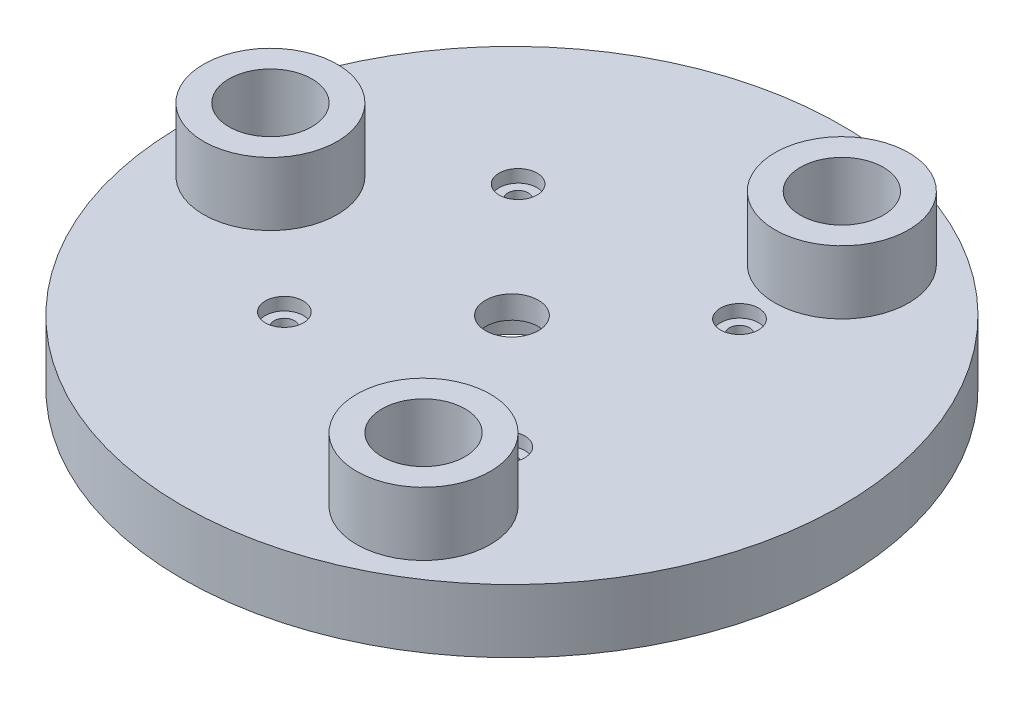
ISO-10303-21;
HEADER;
FILE_DESCRIPTION(('STEP AP214'),'2;1');
FILE_NAME('part.step','',(''),(''),'','','');
FILE_SCHEMA(('AUTOMOTIVE_DESIGN { 1 0 10303 214 1 1 1 1 }'));
ENDSEC;
DATA;
#1=APPLICATION_CONTEXT('core data for automotive mechanical design processes');
#2=APPLICATION_PROTOCOL_DEFINITION('international standard','automotive_design',2000,#1);
#3=PRODUCT_CONTEXT('',#1,'mechanical');
#4=PRODUCT('Part','Part','',(#3));
#5=PRODUCT_RELATED_PRODUCT_CATEGORY('part','',(#4));
#6=PRODUCT_DEFINITION_FORMATION('','',#4);
#7=PRODUCT_DEFINITION_CONTEXT('part definition',#1,'design');
#8=PRODUCT_DEFINITION('design','',#6,#7);
#9=PRODUCT_DEFINITION_SHAPE('','',#8);
#10=(LENGTH_UNIT() NAMED_UNIT(*) SI_UNIT(.MILLI.,.METRE.));
#11=(NAMED_UNIT(*) PLANE_ANGLE_UNIT() SI_UNIT($,.RADIAN.));
#12=(NAMED_UNIT(*) SI_UNIT($,.STERADIAN.) SOLID_ANGLE_UNIT());
#13=UNCERTAINTY_MEASURE_WITH_UNIT(LENGTH_MEASURE(1.E-05),#10,'distance_accuracy_value','');
#14=(GEOMETRIC_REPRESENTATION_CONTEXT(3) GLOBAL_UNCERTAINTY_ASSIGNED_CONTEXT((#13)) GLOBAL_UNIT_ASSIGNED_CONTEXT((#10,
#11,#12)) REPRESENTATION_CONTEXT('',''));
#15=CARTESIAN_POINT('',(0.,0.,0.));
#16=DIRECTION('',(0.,0.,1.));
#17=DIRECTION('',(1.,0.,0.));
#18=AXIS2_PLACEMENT_3D('',#15,#16,#17);
#19=CARTESIAN_POINT('',(-9.22076389517279,0.,8.73312734302385));
#20=DIRECTION('',(0.,1.,0.));
#21=DIRECTION('',(0.,0.,1.));
#22=AXIS2_PLACEMENT_3D('',#19,#20,#21);
#23=CYLINDRICAL_SURFACE('',#22,0.800000000000784);
#24=CARTESIAN_POINT('',(-9.22076389517279,0.,8.73312734302385));
#25=DIRECTION('',(0.,1.,0.));
#26=DIRECTION('',(0.,0.,1.));
#27=AXIS2_PLACEMENT_3D('',#24,#25,#26);
#28=CIRCLE('',#27,0.800000000000784);
#29=CARTESIAN_POINT('',(-9.22076389517279,0.,9.53312734302463));
#30=VERTEX_POINT('',#29);
#31=EDGE_CURVE('E61',#30,#30,#28,.T.);
#32=ORIENTED_EDGE('',*,*,#31,.F.);
#33=EDGE_LOOP('',(#32));
#34=FACE_BOUND('',#33,.T.);
#35=CARTESIAN_POINT('',(-9.22076389517279,4.,8.73312734302385));
#36=DIRECTION('',(0.,1.,0.));
#37=DIRECTION('',(0.,0.,1.));
#38=AXIS2_PLACEMENT_3D('',#35,#36,#37);
#39=CIRCLE('',#38,0.800000000000784);
#40=CARTESIAN_POINT('',(-9.22076389517279,4.,9.53312734302463));
#41=VERTEX_POINT('',#40);
#42=EDGE_CURVE('E35',#41,#41,#39,.F.);
#43=ORIENTED_EDGE('',*,*,#42,.F.);
#44=EDGE_LOOP('',(#43));
#45=FACE_BOUND('',#44,.T.);
#46=ADVANCED_FACE('F31',(#34,#45),#23,.F.);
#47=CARTESIAN_POINT('',(8.73312734302434,0.,9.22076389517291));
#48=DIRECTION('',(0.,1.,0.));
#49=DIRECTION('',(0.,0.,1.));
#50=AXIS2_PLACEMENT_3D('',#47,#48,#49);
#51=CYLINDRICAL_SURFACE('',#50,0.800000000000784);
#52=CARTESIAN_POINT('',(8.73312734302434,0.,9.22076389517291));
#53=DIRECTION('',(0.,1.,0.));
#54=DIRECTION('',(0.,0.,1.));
#55=AXIS2_PLACEMENT_3D('',#52,#53,#54);
#56=CIRCLE('',#55,0.800000000000784);
#57=CARTESIAN_POINT('',(8.73312734302434,0.,10.0207638951737));
#58=VERTEX_POINT('',#57);
#59=EDGE_CURVE('E94',#58,#58,#56,.T.);
#60=ORIENTED_EDGE('',*,*,#59,.F.);
#61=EDGE_LOOP('',(#60));
#62=FACE_BOUND('',#61,.T.);
#63=CARTESIAN_POINT('',(8.73312734302434,4.,9.22076389517291));
#64=DIRECTION('',(0.,1.,0.));
#65=DIRECTION('',(0.,0.,1.));
#66=AXIS2_PLACEMENT_3D('',#63,#64,#65);
#67=CIRCLE('',#66,0.800000000000784);
#68=CARTESIAN_POINT('',(8.73312734302434,4.,10.0207638951737));
#69=VERTEX_POINT('',#68);
#70=EDGE_CURVE('E67',#69,#69,#67,.F.);
#71=ORIENTED_EDGE('',*,*,#70,.F.);
#72=EDGE_LOOP('',(#71));
#73=FACE_BOUND('',#72,.T.);
#74=ADVANCED_FACE('F158',(#62,#73),#51,.F.);
#75=CARTESIAN_POINT('',(9.2207638951734,0.,-8.73312734302422));
#76=DIRECTION('',(0.,1.,0.));
#77=DIRECTION('',(0.,0.,1.));
#78=AXIS2_PLACEMENT_3D('',#75,#76,#77);
#79=CYLINDRICAL_SURFACE('',#78,0.800000000000784);
#80=CARTESIAN_POINT('',(9.2207638951734,0.,-8.73312734302422));
#81=DIRECTION('',(0.,1.,0.));
#82=DIRECTION('',(0.,0.,1.));
#83=AXIS2_PLACEMENT_3D('',#80,#81,#82);
#84=CIRCLE('',#83,0.800000000000784);
#85=CARTESIAN_POINT('',(9.2207638951734,0.,-7.93312734302344));
#86=VERTEX_POINT('',#85);
#87=EDGE_CURVE('E97',#86,#86,#84,.T.);
#88=ORIENTED_EDGE('',*,*,#87,.F.);
#89=EDGE_LOOP('',(#88));
#90=FACE_BOUND('',#89,.T.);
#91=CARTESIAN_POINT('',(9.2207638951734,4.,-8.73312734302422));
#92=DIRECTION('',(0.,1.,0.));
#93=DIRECTION('',(0.,0.,1.));
#94=AXIS2_PLACEMENT_3D('',#91,#92,#93);
#95=CIRCLE('',#94,0.800000000000784);
#96=CARTESIAN_POINT('',(9.2207638951734,4.,-7.93312734302344));
#97=VERTEX_POINT('',#96);
#98=EDGE_CURVE('E63',#97,#97,#95,.F.);
#99=ORIENTED_EDGE('',*,*,#98,.F.);
#100=EDGE_LOOP('',(#99));
#101=FACE_BOUND('',#100,.T.);
#102=ADVANCED_FACE('F164',(#90,#101),#79,.F.);
#103=CARTESIAN_POINT('',(-8.73312734302373,0.,-9.22076389517329));
#104=DIRECTION('',(0.,1.,0.));
#105=DIRECTION('',(0.,0.,1.));
#106=AXIS2_PLACEMENT_3D('',#103,#104,#105);
#107=CYLINDRICAL_SURFACE('',#106,0.800000000000784);
#108=CARTESIAN_POINT('',(-8.73312734302373,0.,-9.22076389517329));
#109=DIRECTION('',(0.,1.,0.));
#110=DIRECTION('',(0.,0.,1.));
#111=AXIS2_PLACEMENT_3D('',#108,#109,#110);
#112=CIRCLE('',#111,0.800000000000784);
#113=CARTESIAN_POINT('',(-8.73312734302373,0.,-8.4207638951725));
#114=VERTEX_POINT('',#113);
#115=EDGE_CURVE('E100',#114,#114,#112,.T.);
#116=ORIENTED_EDGE('',*,*,#115,.F.);
#117=EDGE_LOOP('',(#116));
#118=FACE_BOUND('',#117,.T.);
#119=CARTESIAN_POINT('',(-8.73312734302373,4.,-9.22076389517329));
#120=DIRECTION('',(0.,1.,0.));
#121=DIRECTION('',(0.,0.,1.));
#122=AXIS2_PLACEMENT_3D('',#119,#120,#121);
#123=CIRCLE('',#122,0.800000000000784);
#124=CARTESIAN_POINT('',(-8.73312734302373,4.,-8.4207638951725));
#125=VERTEX_POINT('',#124);
#126=EDGE_CURVE('E58',#125,#125,#123,.F.);
#127=ORIENTED_EDGE('',*,*,#126,.F.);
#128=EDGE_LOOP('',(#127));
#129=FACE_BOUND('',#128,.T.);
#130=ADVANCED_FACE('F175',(#118,#129),#107,.F.);
#131=CARTESIAN_POINT('',(0.,10.,2.99231768478796E-13));
#132=DIRECTION('',(0.,-1.,0.));
#133=DIRECTION('',(0.,0.,-1.));
#134=AXIS2_PLACEMENT_3D('',#131,#132,#133);
#135=CYLINDRICAL_SURFACE('',#134,2.08564814814815);
#136=CARTESIAN_POINT('',(0.,5.,2.99231768478796E-13));
#137=DIRECTION('',(0.,1.,0.));
#138=DIRECTION('',(0.,0.,1.));
#139=AXIS2_PLACEMENT_3D('',#136,#137,#138);
#140=CIRCLE('',#139,2.08564814814815);
#141=CARTESIAN_POINT('',(0.,5.,2.08564814814845));
#142=VERTEX_POINT('',#141);
#143=EDGE_CURVE('E48',#142,#142,#140,.T.);
#144=ORIENTED_EDGE('',*,*,#143,.T.);
#145=EDGE_LOOP('',(#144));
#146=FACE_BOUND('',#145,.T.);
#147=CARTESIAN_POINT('',(0.,3.2,2.99231768478796E-13));
#148=DIRECTION('',(0.,-1.,0.));
#149=DIRECTION('',(0.,0.,-1.));
#150=AXIS2_PLACEMENT_3D('',#147,#148,#149);
#151=CIRCLE('',#150,2.08564814814815);
#152=CARTESIAN_POINT('',(0.,3.2,-2.08564814814785));
#153=VERTEX_POINT('',#152);
#154=EDGE_CURVE('E53',#153,#153,#151,.T.);
#155=ORIENTED_EDGE('',*,*,#154,.T.);
#156=EDGE_LOOP('',(#155));
#157=FACE_BOUND('',#156,.T.);
#158=ADVANCED_FACE('F179',(#146,#157),#135,.F.);
#159=CARTESIAN_POINT('',(0.,10.,2.99231768478796E-13));
#160=DIRECTION('',(0.,1.,0.));
#161=DIRECTION('',(0.,0.,1.));
#162=AXIS2_PLACEMENT_3D('',#159,#160,#161);
#163=PLANE('',#162);
#164=CARTESIAN_POINT('',(9.52625000000018,10.,-16.4999490056029));
#165=DIRECTION('',(0.,-1.,0.));
#166=DIRECTION('',(0.,0.,-1.));
#167=AXIS2_PLACEMENT_3D('',#164,#165,#166);
#168=CIRCLE('',#167,3.27499999999973);
#169=CARTESIAN_POINT('',(9.52625000000018,10.,-19.7749490056027));
#170=VERTEX_POINT('',#169);
#171=EDGE_CURVE('E44',#170,#170,#168,.T.);
#172=ORIENTED_EDGE('',*,*,#171,.T.);
#173=EDGE_LOOP('',(#172));
#174=FACE_BOUND('',#173,.T.);
#175=CARTESIAN_POINT('',(9.52625000000018,10.,-16.4999490056029));
#176=DIRECTION('',(0.,1.,0.));
#177=DIRECTION('',(0.,0.,1.));
#178=AXIS2_PLACEMENT_3D('',#175,#176,#177);
#179=CIRCLE('',#178,5.27499999999971);
#180=CARTESIAN_POINT('',(9.52625000000018,10.,-11.2249490056032));
#181=VERTEX_POINT('',#180);
#182=EDGE_CURVE('E117',#181,#181,#179,.T.);
#183=ORIENTED_EDGE('',*,*,#182,.T.);
#184=EDGE_LOOP('',(#183));
#185=FACE_BOUND('',#184,.T.);
#186=ADVANCED_FACE('F153',(#174,#185),#163,.T.);
#187=CARTESIAN_POINT('',(9.52625000000018,2.5,-16.4999490056029));
#188=DIRECTION('',(0.,1.,0.));
#189=DIRECTION('',(0.,0.,1.));
#190=AXIS2_PLACEMENT_3D('',#187,#188,#189);
#191=CYLINDRICAL_SURFACE('',#190,3.27499999999973);
#192=CARTESIAN_POINT('',(9.52625000000018,2.5,-16.4999490056029));
#193=DIRECTION('',(0.,-1.,0.));
#194=DIRECTION('',(0.,0.,-1.));
#195=AXIS2_PLACEMENT_3D('',#192,#193,#194);
#196=CIRCLE('',#195,3.27499999999973);
#197=CARTESIAN_POINT('',(9.52625000000018,2.5,-19.7749490056027));
#198=VERTEX_POINT('',#197);
#199=EDGE_CURVE('E39',#198,#198,#196,.T.);
#200=ORIENTED_EDGE('',*,*,#199,.T.);
#201=EDGE_LOOP('',(#200));
#202=FACE_BOUND('',#201,.T.);
#203=ORIENTED_EDGE('',*,*,#171,.F.);
#204=EDGE_LOOP('',(#203));
#205=FACE_BOUND('',#204,.T.);
#206=ADVANCED_FACE('F229',(#202,#205),#191,.F.);
#207=CARTESIAN_POINT('',(9.52625000000018,2.5,-16.4999490056029));
#208=DIRECTION('',(0.,-1.,0.));
#209=DIRECTION('',(0.,0.,-1.));
#210=AXIS2_PLACEMENT_3D('',#207,#208,#209);
#211=PLANE('',#210);
#212=ORIENTED_EDGE('',*,*,#199,.F.);
#213=EDGE_LOOP('',(#212));
#214=FACE_BOUND('',#213,.T.);
#215=ADVANCED_FACE('F207',(#214),#211,.F.);
#216=CARTESIAN_POINT('',(0.,5.,3.04877650902924E-13));
#217=DIRECTION('',(0.,1.,0.));
#218=DIRECTION('',(0.,0.,1.));
#219=AXIS2_PLACEMENT_3D('',#216,#217,#218);
#220=PLANE('',#219);
#221=CARTESIAN_POINT('',(-9.22076389517278,5.,8.73312734302375));
#222=DIRECTION('',(0.,1.,0.));
#223=DIRECTION('',(0.,0.,1.));
#224=AXIS2_PLACEMENT_3D('',#221,#222,#223);
#225=CIRCLE('',#224,1.500000048);
#226=CARTESIAN_POINT('',(-9.22076389517278,5.,10.2331273910237));
#227=VERTEX_POINT('',#226);
#228=EDGE_CURVE('E83',#227,#227,#225,.T.);
#229=ORIENTED_EDGE('',*,*,#228,.F.);
#230=EDGE_LOOP('',(#229));
#231=FACE_BOUND('',#230,.T.);
#232=CARTESIAN_POINT('',(8.73312734302425,5.,9.22076389517279));
#233=DIRECTION('',(0.,1.,0.));
#234=DIRECTION('',(0.,0.,1.));
#235=AXIS2_PLACEMENT_3D('',#232,#233,#234);
#236=CIRCLE('',#235,1.500000048);
#237=CARTESIAN_POINT('',(8.73312734302425,5.,10.7207639431728));
#238=VERTEX_POINT('',#237);
#239=EDGE_CURVE('E76',#238,#238,#236,.T.);
#240=ORIENTED_EDGE('',*,*,#239,.F.);
#241=EDGE_LOOP('',(#240));
#242=FACE_BOUND('',#241,.T.);
#243=CARTESIAN_POINT('',(9.2207638951733,5.,-8.73312734302424));
#244=DIRECTION('',(0.,1.,0.));
#245=DIRECTION('',(0.,0.,1.));
#246=AXIS2_PLACEMENT_3D('',#243,#244,#245);
#247=CIRCLE('',#246,1.500000048);
#248=CARTESIAN_POINT('',(9.2207638951733,5.,-7.23312729502424));
#249=VERTEX_POINT('',#248);
#250=EDGE_CURVE('E69',#249,#249,#247,.T.);
#251=ORIENTED_EDGE('',*,*,#250,.F.);
#252=EDGE_LOOP('',(#251));
#253=FACE_BOUND('',#252,.T.);
#254=CARTESIAN_POINT('',(-8.73312734302373,5.,-9.22076389517329));
#255=DIRECTION('',(0.,1.,0.));
#256=DIRECTION('',(0.,0.,1.));
#257=AXIS2_PLACEMENT_3D('',#254,#255,#256);
#258=CIRCLE('',#257,1.500000048);
#259=CARTESIAN_POINT('',(-8.73312734302373,5.,-7.72076384717329));
#260=VERTEX_POINT('',#259);
#261=EDGE_CURVE('E65',#260,#260,#258,.T.);
#262=ORIENTED_EDGE('',*,*,#261,.F.);
#263=EDGE_LOOP('',(#262));
#264=FACE_BOUND('',#263,.T.);
#265=ORIENTED_EDGE('',*,*,#143,.F.);
#266=EDGE_LOOP('',(#265));
#267=FACE_BOUND('',#266,.T.);
#268=CARTESIAN_POINT('',(-19.0524999999996,5.,0.));
#269=DIRECTION('',(0.,1.,0.));
#270=DIRECTION('',(0.,0.,1.));
#271=AXIS2_PLACEMENT_3D('',#268,#269,#270);
#272=CIRCLE('',#271,5.27499999999964);
#273=CARTESIAN_POINT('',(-19.0524999999996,5.,5.2749999999997));
#274=VERTEX_POINT('',#273);
#275=EDGE_CURVE('E108',#274,#274,#272,.T.);
#276=ORIENTED_EDGE('',*,*,#275,.F.);
#277=EDGE_LOOP('',(#276));
#278=FACE_BOUND('',#277,.T.);
#279=CARTESIAN_POINT('',(9.52625000000006,5.,16.4999490056029));
#280=DIRECTION('',(0.,1.,0.));
#281=DIRECTION('',(0.,0.,1.));
#282=AXIS2_PLACEMENT_3D('',#279,#280,#281);
#283=CIRCLE('',#282,5.275);
#284=CARTESIAN_POINT('',(9.52625000000006,5.,21.7749490056029));
#285=VERTEX_POINT('',#284);
#286=EDGE_CURVE('E114',#285,#285,#283,.T.);
#287=ORIENTED_EDGE('',*,*,#286,.F.);
#288=EDGE_LOOP('',(#287));
#289=FACE_BOUND('',#288,.T.);
#290=CARTESIAN_POINT('',(9.52625000000018,5.,-16.4999490056029));
#291=DIRECTION('',(0.,1.,0.));
#292=DIRECTION('',(0.,0.,1.));
#293=AXIS2_PLACEMENT_3D('',#290,#291,#292);
#294=CIRCLE('',#293,5.27499999999971);
#295=CARTESIAN_POINT('',(9.52625000000018,5.,-11.2249490056032));
#296=VERTEX_POINT('',#295);
#297=EDGE_CURVE('E120',#296,#296,#294,.T.);
#298=ORIENTED_EDGE('',*,*,#297,.F.);
#299=EDGE_LOOP('',(#298));
#300=FACE_BOUND('',#299,.T.);
#301=CARTESIAN_POINT('',(0.,5.,3.04877650902924E-13));
#302=DIRECTION('',(0.,1.,0.));
#303=DIRECTION('',(0.,0.,1.));
#304=AXIS2_PLACEMENT_3D('',#301,#302,#303);
#305=CIRCLE('',#304,26.);
#306=CARTESIAN_POINT('',(0.,5.,26.0000000000003));
#307=VERTEX_POINT('',#306);
#308=EDGE_CURVE('E52',#307,#307,#305,.T.);
#309=ORIENTED_EDGE('',*,*,#308,.T.);
#310=EDGE_LOOP('',(#309));
#311=FACE_BOUND('',#310,.T.);
#312=ADVANCED_FACE('F203',(#231,#242,#253,#264,#267,#278,#289,#300,#311),#220,.T.);
#313=CARTESIAN_POINT('',(9.52625000000018,5.,-16.4999490056029));
#314=DIRECTION('',(0.,1.,0.));
#315=DIRECTION('',(0.,0.,1.));
#316=AXIS2_PLACEMENT_3D('',#313,#314,#315);
#317=CYLINDRICAL_SURFACE('',#316,5.27499999999971);
#318=ORIENTED_EDGE('',*,*,#297,.T.);
#319=EDGE_LOOP('',(#318));
#320=FACE_BOUND('',#319,.T.);
#321=ORIENTED_EDGE('',*,*,#182,.F.);
#322=EDGE_LOOP('',(#321));
#323=FACE_BOUND('',#322,.T.);
#324=ADVANCED_FACE('F199',(#320,#323),#317,.T.);
#325=CARTESIAN_POINT('',(9.52625000000006,5.,16.4999490056029));
#326=DIRECTION('',(0.,1.,0.));
#327=DIRECTION('',(0.,0.,1.));
#328=AXIS2_PLACEMENT_3D('',#325,#326,#327);
#329=CYLINDRICAL_SURFACE('',#328,5.275);
#330=ORIENTED_EDGE('',*,*,#286,.T.);
#331=EDGE_LOOP('',(#330));
#332=FACE_BOUND('',#331,.T.);
#333=CARTESIAN_POINT('',(9.52625000000006,10.,16.4999490056029));
#334=DIRECTION('',(0.,1.,0.));
#335=DIRECTION('',(0.,0.,1.));
#336=AXIS2_PLACEMENT_3D('',#333,#334,#335);
#337=CIRCLE('',#336,5.275);
#338=CARTESIAN_POINT('',(9.52625000000006,10.,21.7749490056029));
#339=VERTEX_POINT('',#338);
#340=EDGE_CURVE('E111',#339,#339,#337,.T.);
#341=ORIENTED_EDGE('',*,*,#340,.F.);
#342=EDGE_LOOP('',(#341));
#343=FACE_BOUND('',#342,.T.);
#344=ADVANCED_FACE('F195',(#332,#343),#329,.T.);
#345=CARTESIAN_POINT('',(-19.0524999999996,5.,0.));
#346=DIRECTION('',(0.,1.,0.));
#347=DIRECTION('',(0.,0.,1.));
#348=AXIS2_PLACEMENT_3D('',#345,#346,#347);
#349=CYLINDRICAL_SURFACE('',#348,5.27499999999964);
#350=ORIENTED_EDGE('',*,*,#275,.T.);
#351=EDGE_LOOP('',(#350));
#352=FACE_BOUND('',#351,.T.);
#353=CARTESIAN_POINT('',(-19.0524999999996,10.,0.));
#354=DIRECTION('',(0.,1.,0.));
#355=DIRECTION('',(0.,0.,1.));
#356=AXIS2_PLACEMENT_3D('',#353,#354,#355);
#357=CIRCLE('',#356,5.27499999999964);
#358=CARTESIAN_POINT('',(-19.0524999999996,10.,5.2749999999997));
#359=VERTEX_POINT('',#358);
#360=EDGE_CURVE('E56',#359,#359,#357,.T.);
#361=ORIENTED_EDGE('',*,*,#360,.F.);
#362=EDGE_LOOP('',(#361));
#363=FACE_BOUND('',#362,.T.);
#364=ADVANCED_FACE('F191',(#352,#363),#349,.T.);
#365=CARTESIAN_POINT('',(-19.0524999999996,2.5,0.));
#366=DIRECTION('',(0.,-1.,0.));
#367=DIRECTION('',(0.,0.,-1.));
#368=AXIS2_PLACEMENT_3D('',#365,#366,#367);
#369=PLANE('',#368);
#370=CARTESIAN_POINT('',(-19.0524999999996,2.5,0.));
#371=DIRECTION('',(0.,-1.,0.));
#372=DIRECTION('',(0.,0.,-1.));
#373=AXIS2_PLACEMENT_3D('',#370,#371,#372);
#374=CIRCLE('',#373,3.27499999999954);
#375=CARTESIAN_POINT('',(-19.0524999999996,2.5,-3.27499999999948));
#376=VERTEX_POINT('',#375);
#377=EDGE_CURVE('E127',#376,#376,#374,.T.);
#378=ORIENTED_EDGE('',*,*,#377,.F.);
#379=EDGE_LOOP('',(#378));
#380=FACE_BOUND('',#379,.T.);
#381=ADVANCED_FACE('F194',(#380),#369,.F.);
#382=CARTESIAN_POINT('',(-19.0524999999996,2.5,0.));
#383=DIRECTION('',(0.,1.,0.));
#384=DIRECTION('',(0.,0.,1.));
#385=AXIS2_PLACEMENT_3D('',#382,#383,#384);
#386=CYLINDRICAL_SURFACE('',#385,3.27499999999954);
#387=ORIENTED_EDGE('',*,*,#377,.T.);
#388=EDGE_LOOP('',(#387));
#389=FACE_BOUND('',#388,.T.);
#390=CARTESIAN_POINT('',(-19.0524999999996,10.,0.));
#391=DIRECTION('',(0.,-1.,0.));
#392=DIRECTION('',(0.,0.,-1.));
#393=AXIS2_PLACEMENT_3D('',#390,#391,#392);
#394=CIRCLE('',#393,3.27499999999954);
#395=CARTESIAN_POINT('',(-19.0524999999996,10.,-3.27499999999948));
#396=VERTEX_POINT('',#395);
#397=EDGE_CURVE('E51',#396,#396,#394,.T.);
#398=ORIENTED_EDGE('',*,*,#397,.F.);
#399=EDGE_LOOP('',(#398));
#400=FACE_BOUND('',#399,.T.);
#401=ADVANCED_FACE('F211',(#389,#400),#386,.F.);
#402=ORIENTED_EDGE('',*,*,#397,.T.);
#403=EDGE_LOOP('',(#402));
#404=FACE_BOUND('',#403,.T.);
#405=ORIENTED_EDGE('',*,*,#360,.T.);
#406=EDGE_LOOP('',(#405));
#407=FACE_BOUND('',#406,.T.);
#408=ADVANCED_FACE('F152',(#404,#407),#163,.T.);
#409=CARTESIAN_POINT('',(9.52625000000006,2.5,16.4999490056029));
#410=DIRECTION('',(0.,-1.,0.));
#411=DIRECTION('',(0.,0.,-1.));
#412=AXIS2_PLACEMENT_3D('',#409,#410,#411);
#413=PLANE('',#412);
#414=CARTESIAN_POINT('',(9.52625000000006,2.5,16.4999490056029));
#415=DIRECTION('',(0.,-1.,0.));
#416=DIRECTION('',(0.,0.,-1.));
#417=AXIS2_PLACEMENT_3D('',#414,#415,#416);
#418=CIRCLE('',#417,3.275);
#419=CARTESIAN_POINT('',(9.52625000000006,2.5,13.2249490056029));
#420=VERTEX_POINT('',#419);
#421=EDGE_CURVE('E133',#420,#420,#418,.T.);
#422=ORIENTED_EDGE('',*,*,#421,.F.);
#423=EDGE_LOOP('',(#422));
#424=FACE_BOUND('',#423,.T.);
#425=ADVANCED_FACE('F144',(#424),#413,.F.);
#426=CARTESIAN_POINT('',(9.52625000000006,2.5,16.4999490056029));
#427=DIRECTION('',(0.,1.,0.));
#428=DIRECTION('',(0.,0.,1.));
#429=AXIS2_PLACEMENT_3D('',#426,#427,#428);
#430=CYLINDRICAL_SURFACE('',#429,3.275);
#431=ORIENTED_EDGE('',*,*,#421,.T.);
#432=EDGE_LOOP('',(#431));
#433=FACE_BOUND('',#432,.T.);
#434=CARTESIAN_POINT('',(9.52625000000006,10.,16.4999490056029));
#435=DIRECTION('',(0.,-1.,0.));
#436=DIRECTION('',(0.,0.,-1.));
#437=AXIS2_PLACEMENT_3D('',#434,#435,#436);
#438=CIRCLE('',#437,3.275);
#439=CARTESIAN_POINT('',(9.52625000000006,10.,13.2249490056029));
#440=VERTEX_POINT('',#439);
#441=EDGE_CURVE('E130',#440,#440,#438,.T.);
#442=ORIENTED_EDGE('',*,*,#441,.F.);
#443=EDGE_LOOP('',(#442));
#444=FACE_BOUND('',#443,.T.);
#445=ADVANCED_FACE('F142',(#433,#444),#430,.F.);
#446=ORIENTED_EDGE('',*,*,#441,.T.);
#447=EDGE_LOOP('',(#446));
#448=FACE_BOUND('',#447,.T.);
#449=ORIENTED_EDGE('',*,*,#340,.T.);
#450=EDGE_LOOP('',(#449));
#451=FACE_BOUND('',#450,.T.);
#452=ADVANCED_FACE('F139',(#448,#451),#163,.T.);
#453=CARTESIAN_POINT('',(0.,10.,2.99231768478796E-13));
#454=DIRECTION('',(0.,-1.,0.));
#455=DIRECTION('',(0.,0.,-1.));
#456=AXIS2_PLACEMENT_3D('',#453,#454,#455);
#457=CYLINDRICAL_SURFACE('',#456,26.);
#458=CARTESIAN_POINT('',(0.,0.,2.99231768478796E-13));
#459=DIRECTION('',(0.,1.,0.));
#460=DIRECTION('',(0.,0.,1.));
#461=AXIS2_PLACEMENT_3D('',#458,#459,#460);
#462=CIRCLE('',#461,26.);
#463=CARTESIAN_POINT('',(0.,0.,26.0000000000003));
#464=VERTEX_POINT('',#463);
#465=EDGE_CURVE('E10',#464,#464,#462,.T.);
#466=ORIENTED_EDGE('',*,*,#465,.T.);
#467=EDGE_LOOP('',(#466));
#468=FACE_BOUND('',#467,.T.);
#469=ORIENTED_EDGE('',*,*,#308,.F.);
#470=EDGE_LOOP('',(#469));
#471=FACE_BOUND('',#470,.T.);
#472=ADVANCED_FACE('F33',(#468,#471),#457,.T.);
#473=CARTESIAN_POINT('',(0.,0.,2.99231768478796E-13));
#474=DIRECTION('',(0.,1.,0.));
#475=DIRECTION('',(0.,0.,1.));
#476=AXIS2_PLACEMENT_3D('',#473,#474,#475);
#477=PLANE('',#476);
#478=ORIENTED_EDGE('',*,*,#31,.T.);
#479=EDGE_LOOP('',(#478));
#480=FACE_BOUND('',#479,.T.);
#481=ORIENTED_EDGE('',*,*,#59,.T.);
#482=EDGE_LOOP('',(#481));
#483=FACE_BOUND('',#482,.T.);
#484=ORIENTED_EDGE('',*,*,#87,.T.);
#485=EDGE_LOOP('',(#484));
#486=FACE_BOUND('',#485,.T.);
#487=ORIENTED_EDGE('',*,*,#115,.T.);
#488=EDGE_LOOP('',(#487));
#489=FACE_BOUND('',#488,.T.);
#490=CARTESIAN_POINT('',(0.,0.,3.04877650902924E-13));
#491=DIRECTION('',(0.,-1.,0.));
#492=DIRECTION('',(0.,0.,-1.));
#493=AXIS2_PLACEMENT_3D('',#490,#491,#492);
#494=CIRCLE('',#493,5.25);
#495=CARTESIAN_POINT('',(0.,0.,-5.2499999999997));
#496=VERTEX_POINT('',#495);
#497=EDGE_CURVE('E103',#496,#496,#494,.T.);
#498=ORIENTED_EDGE('',*,*,#497,.F.);
#499=EDGE_LOOP('',(#498));
#500=FACE_BOUND('',#499,.T.);
#501=ORIENTED_EDGE('',*,*,#465,.F.);
#502=EDGE_LOOP('',(#501));
#503=FACE_BOUND('',#502,.T.);
#504=ADVANCED_FACE('F189',(#480,#483,#486,#489,#500,#503),#477,.F.);
#505=CARTESIAN_POINT('',(0.,3.2,3.04877650902924E-13));
#506=DIRECTION('',(0.,-1.,0.));
#507=DIRECTION('',(0.,0.,-1.));
#508=AXIS2_PLACEMENT_3D('',#505,#506,#507);
#509=CYLINDRICAL_SURFACE('',#508,5.25);
#510=CARTESIAN_POINT('',(0.,3.2,3.04877650902924E-13));
#511=DIRECTION('',(0.,-1.,0.));
#512=DIRECTION('',(0.,0.,-1.));
#513=AXIS2_PLACEMENT_3D('',#510,#511,#512);
#514=CIRCLE('',#513,5.25);
#515=CARTESIAN_POINT('',(0.,3.2,-5.2499999999997));
#516=VERTEX_POINT('',#515);
#517=EDGE_CURVE('E57',#516,#516,#514,.T.);
#518=ORIENTED_EDGE('',*,*,#517,.F.);
#519=EDGE_LOOP('',(#518));
#520=FACE_BOUND('',#519,.T.);
#521=ORIENTED_EDGE('',*,*,#497,.T.);
#522=EDGE_LOOP('',(#521));
#523=FACE_BOUND('',#522,.T.);
#524=ADVANCED_FACE('F185',(#520,#523),#509,.F.);
#525=CARTESIAN_POINT('',(0.,3.2,3.04877650902924E-13));
#526=DIRECTION('',(0.,-1.,0.));
#527=DIRECTION('',(0.,0.,-1.));
#528=AXIS2_PLACEMENT_3D('',#525,#526,#527);
#529=PLANE('',#528);
#530=ORIENTED_EDGE('',*,*,#154,.F.);
#531=EDGE_LOOP('',(#530));
#532=FACE_BOUND('',#531,.T.);
#533=ORIENTED_EDGE('',*,*,#517,.T.);
#534=EDGE_LOOP('',(#533));
#535=FACE_BOUND('',#534,.T.);
#536=ADVANCED_FACE('F181',(#532,#535),#529,.T.);
#537=CARTESIAN_POINT('',(-8.73312734302373,4.,-9.22076389517329));
#538=DIRECTION('',(0.,1.,0.));
#539=DIRECTION('',(0.,0.,1.));
#540=AXIS2_PLACEMENT_3D('',#537,#538,#539);
#541=PLANE('',#540);
#542=CARTESIAN_POINT('',(-8.73312734302373,4.,-9.22076389517329));
#543=DIRECTION('',(0.,1.,0.));
#544=DIRECTION('',(0.,0.,1.));
#545=AXIS2_PLACEMENT_3D('',#542,#543,#544);
#546=CIRCLE('',#545,1.500000048);
#547=CARTESIAN_POINT('',(-8.73312734302373,4.,-7.72076384717329));
#548=VERTEX_POINT('',#547);
#549=EDGE_CURVE('E62',#548,#548,#546,.T.);
#550=ORIENTED_EDGE('',*,*,#549,.T.);
#551=EDGE_LOOP('',(#550));
#552=FACE_BOUND('',#551,.T.);
#553=ORIENTED_EDGE('',*,*,#126,.T.);
#554=EDGE_LOOP('',(#553));
#555=FACE_BOUND('',#554,.T.);
#556=ADVANCED_FACE('F184',(#552,#555),#541,.T.);
#557=CARTESIAN_POINT('',(-8.73312734302373,4.,-9.22076389517329));
#558=DIRECTION('',(0.,1.,0.));
#559=DIRECTION('',(0.,0.,1.));
#560=AXIS2_PLACEMENT_3D('',#557,#558,#559);
#561=CYLINDRICAL_SURFACE('',#560,1.500000048);
#562=ORIENTED_EDGE('',*,*,#549,.F.);
#563=EDGE_LOOP('',(#562));
#564=FACE_BOUND('',#563,.T.);
#565=ORIENTED_EDGE('',*,*,#261,.T.);
#566=EDGE_LOOP('',(#565));
#567=FACE_BOUND('',#566,.T.);
#568=ADVANCED_FACE('F170',(#564,#567),#561,.F.);
#569=CARTESIAN_POINT('',(9.2207638951733,4.,-8.73312734302424));
#570=DIRECTION('',(0.,1.,0.));
#571=DIRECTION('',(0.,0.,1.));
#572=AXIS2_PLACEMENT_3D('',#569,#570,#571);
#573=PLANE('',#572);
#574=CARTESIAN_POINT('',(9.2207638951733,4.,-8.73312734302424));
#575=DIRECTION('',(0.,1.,0.));
#576=DIRECTION('',(0.,0.,1.));
#577=AXIS2_PLACEMENT_3D('',#574,#575,#576);
#578=CIRCLE('',#577,1.500000048);
#579=CARTESIAN_POINT('',(9.2207638951733,4.,-7.23312729502424));
#580=VERTEX_POINT('',#579);
#581=EDGE_CURVE('E66',#580,#580,#578,.T.);
#582=ORIENTED_EDGE('',*,*,#581,.T.);
#583=EDGE_LOOP('',(#582));
#584=FACE_BOUND('',#583,.T.);
#585=ORIENTED_EDGE('',*,*,#98,.T.);
#586=EDGE_LOOP('',(#585));
#587=FACE_BOUND('',#586,.T.);
#588=ADVANCED_FACE('F347',(#584,#587),#573,.T.);
#589=CARTESIAN_POINT('',(9.2207638951733,4.,-8.73312734302424));
#590=DIRECTION('',(0.,1.,0.));
#591=DIRECTION('',(0.,0.,1.));
#592=AXIS2_PLACEMENT_3D('',#589,#590,#591);
#593=CYLINDRICAL_SURFACE('',#592,1.500000048);
#594=ORIENTED_EDGE('',*,*,#581,.F.);
#595=EDGE_LOOP('',(#594));
#596=FACE_BOUND('',#595,.T.);
#597=ORIENTED_EDGE('',*,*,#250,.T.);
#598=EDGE_LOOP('',(#597));
#599=FACE_BOUND('',#598,.T.);
#600=ADVANCED_FACE('F355',(#596,#599),#593,.F.);
#601=CARTESIAN_POINT('',(8.73312734302425,4.,9.22076389517279));
#602=DIRECTION('',(0.,1.,0.));
#603=DIRECTION('',(0.,0.,1.));
#604=AXIS2_PLACEMENT_3D('',#601,#602,#603);
#605=PLANE('',#604);
#606=CARTESIAN_POINT('',(8.73312734302425,4.,9.22076389517279));
#607=DIRECTION('',(0.,1.,0.));
#608=DIRECTION('',(0.,0.,1.));
#609=AXIS2_PLACEMENT_3D('',#606,#607,#608);
#610=CIRCLE('',#609,1.500000048);
#611=CARTESIAN_POINT('',(8.73312734302425,4.,10.7207639431728));
#612=VERTEX_POINT('',#611);
#613=EDGE_CURVE('E70',#612,#612,#610,.T.);
#614=ORIENTED_EDGE('',*,*,#613,.T.);
#615=EDGE_LOOP('',(#614));
#616=FACE_BOUND('',#615,.T.);
#617=ORIENTED_EDGE('',*,*,#70,.T.);
#618=EDGE_LOOP('',(#617));
#619=FACE_BOUND('',#618,.T.);
#620=ADVANCED_FACE('F364',(#616,#619),#605,.T.);
#621=CARTESIAN_POINT('',(8.73312734302425,4.,9.22076389517279));
#622=DIRECTION('',(0.,1.,0.));
#623=DIRECTION('',(0.,0.,1.));
#624=AXIS2_PLACEMENT_3D('',#621,#622,#623);
#625=CYLINDRICAL_SURFACE('',#624,1.500000048);
#626=ORIENTED_EDGE('',*,*,#613,.F.);
#627=EDGE_LOOP('',(#626));
#628=FACE_BOUND('',#627,.T.);
#629=ORIENTED_EDGE('',*,*,#239,.T.);
#630=EDGE_LOOP('',(#629));
#631=FACE_BOUND('',#630,.T.);
#632=ADVANCED_FACE('F373',(#628,#631),#625,.F.);
#633=CARTESIAN_POINT('',(-9.22076389517278,4.,8.73312734302375));
#634=DIRECTION('',(0.,1.,0.));
#635=DIRECTION('',(0.,0.,1.));
#636=AXIS2_PLACEMENT_3D('',#633,#634,#635);
#637=PLANE('',#636);
#638=CARTESIAN_POINT('',(-9.22076389517278,4.,8.73312734302375));
#639=DIRECTION('',(0.,1.,0.));
#640=DIRECTION('',(0.,0.,1.));
#641=AXIS2_PLACEMENT_3D('',#638,#639,#640);
#642=CIRCLE('',#641,1.500000048);
#643=CARTESIAN_POINT('',(-9.22076389517278,4.,10.2331273910237));
#644=VERTEX_POINT('',#643);
#645=EDGE_CURVE('E468',#644,#644,#642,.T.);
#646=ORIENTED_EDGE('',*,*,#645,.T.);
#647=EDGE_LOOP('',(#646));
#648=FACE_BOUND('',#647,.T.);
#649=ORIENTED_EDGE('',*,*,#42,.T.);
#650=EDGE_LOOP('',(#649));
#651=FACE_BOUND('',#650,.T.);
#652=ADVANCED_FACE('F381',(#648,#651),#637,.T.);
#653=CARTESIAN_POINT('',(-9.22076389517278,4.,8.73312734302375));
#654=DIRECTION('',(0.,1.,0.));
#655=DIRECTION('',(0.,0.,1.));
#656=AXIS2_PLACEMENT_3D('',#653,#654,#655);
#657=CYLINDRICAL_SURFACE('',#656,1.500000048);
#658=ORIENTED_EDGE('',*,*,#645,.F.);
#659=EDGE_LOOP('',(#658));
#660=FACE_BOUND('',#659,.T.);
#661=ORIENTED_EDGE('',*,*,#228,.T.);
#662=EDGE_LOOP('',(#661));
#663=FACE_BOUND('',#662,.T.);
#664=ADVANCED_FACE('F390',(#660,#663),#657,.F.);
#665=CLOSED_SHELL('',(#46,#74,#102,#130,#158,#186,#206,#215,#312,#324,#344,#364,#381,#401,#408,
#425,#445,#452,#472,#504,#524,#536,#556,#568,#588,#600,#620,#632,#652,#664));
#666=MANIFOLD_SOLID_BREP('B2',#665);
#667=ADVANCED_BREP_SHAPE_REPRESENTATION('',(#18,#666),#14);
#668=SHAPE_DEFINITION_REPRESENTATION(#9,#667);
ENDSEC;
END-ISO-10303-21;
